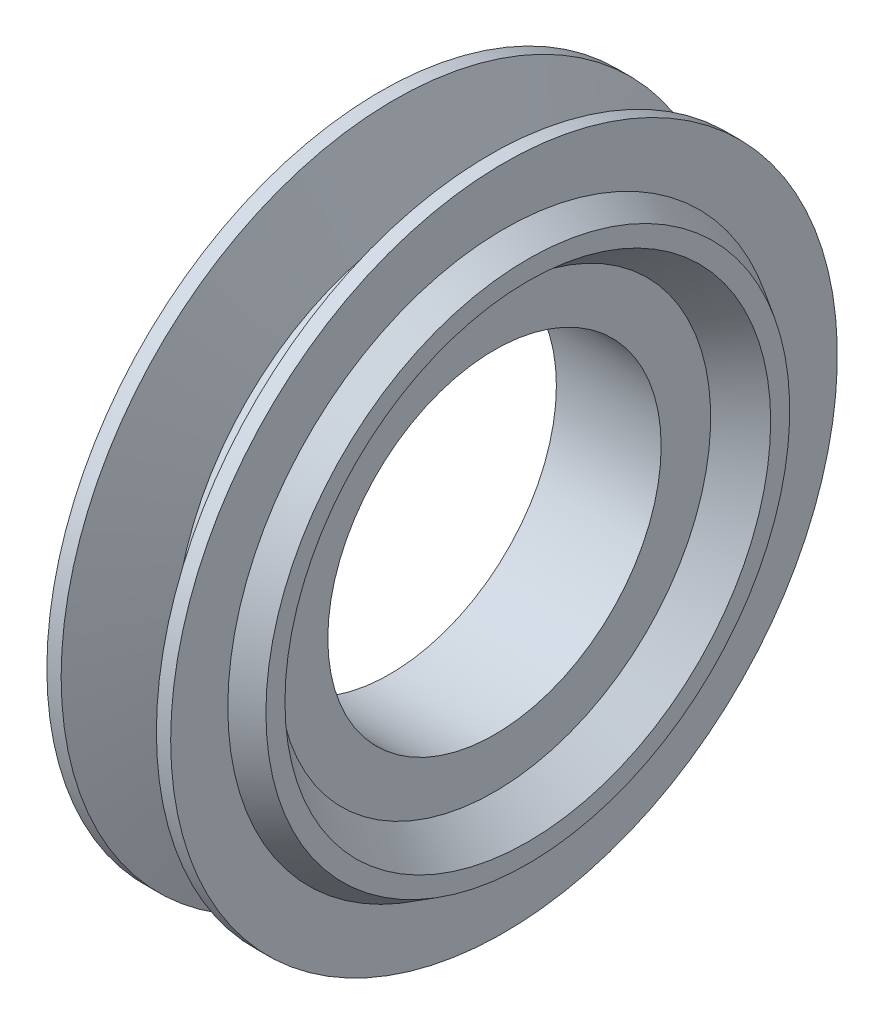
ISO-10303-21;
HEADER;
FILE_DESCRIPTION(('STEP AP214'),'2;1');
FILE_NAME('part.step','',(''),(''),'','','');
FILE_SCHEMA(('AUTOMOTIVE_DESIGN { 1 0 10303 214 1 1 1 1 }'));
ENDSEC;
DATA;
#1=APPLICATION_CONTEXT('core data for automotive mechanical design processes');
#2=APPLICATION_PROTOCOL_DEFINITION('international standard','automotive_design',2000,#1);
#3=PRODUCT_CONTEXT('',#1,'mechanical');
#4=PRODUCT('Part','Part','',(#3));
#5=PRODUCT_RELATED_PRODUCT_CATEGORY('part','',(#4));
#6=PRODUCT_DEFINITION_FORMATION('','',#4);
#7=PRODUCT_DEFINITION_CONTEXT('part definition',#1,'design');
#8=PRODUCT_DEFINITION('design','',#6,#7);
#9=PRODUCT_DEFINITION_SHAPE('','',#8);
#10=(LENGTH_UNIT() NAMED_UNIT(*) SI_UNIT(.MILLI.,.METRE.));
#11=(NAMED_UNIT(*) PLANE_ANGLE_UNIT() SI_UNIT($,.RADIAN.));
#12=(NAMED_UNIT(*) SI_UNIT($,.STERADIAN.) SOLID_ANGLE_UNIT());
#13=UNCERTAINTY_MEASURE_WITH_UNIT(LENGTH_MEASURE(1.E-05),#10,'distance_accuracy_value','');
#14=(GEOMETRIC_REPRESENTATION_CONTEXT(3) GLOBAL_UNCERTAINTY_ASSIGNED_CONTEXT((#13)) GLOBAL_UNIT_ASSIGNED_CONTEXT((#10,
#11,#12)) REPRESENTATION_CONTEXT('',''));
#15=CARTESIAN_POINT('',(0.,0.,0.));
#16=DIRECTION('',(0.,0.,1.));
#17=DIRECTION('',(1.,0.,0.));
#18=AXIS2_PLACEMENT_3D('',#15,#16,#17);
#19=CARTESIAN_POINT('',(5.,0.,0.));
#20=DIRECTION('',(1.,0.,0.));
#21=DIRECTION('',(0.,0.,-1.));
#22=AXIS2_PLACEMENT_3D('',#19,#20,#21);
#23=CONICAL_SURFACE('',#22,35.,1.25638060418322);
#24=CARTESIAN_POINT('',(5.,0.,0.));
#25=DIRECTION('',(-1.,0.,0.));
#26=DIRECTION('',(0.,0.,1.));
#27=AXIS2_PLACEMENT_3D('',#24,#25,#26);
#28=CIRCLE('',#27,35.);
#29=CARTESIAN_POINT('',(5.,0.,35.));
#30=VERTEX_POINT('',#29);
#31=EDGE_CURVE('E68',#30,#30,#28,.T.);
#32=ORIENTED_EDGE('',*,*,#31,.T.);
#33=EDGE_LOOP('',(#32));
#34=FACE_BOUND('',#33,.T.);
#35=CARTESIAN_POINT('',(2.07317073170732,0.,0.));
#36=DIRECTION('',(1.,0.,0.));
#37=DIRECTION('',(0.,0.,-1.));
#38=AXIS2_PLACEMENT_3D('',#35,#36,#37);
#39=CIRCLE('',#38,26.);
#40=CARTESIAN_POINT('',(2.07317073170732,0.,-26.));
#41=VERTEX_POINT('',#40);
#42=EDGE_CURVE('E10',#41,#41,#39,.F.);
#43=ORIENTED_EDGE('',*,*,#42,.F.);
#44=EDGE_LOOP('',(#43));
#45=FACE_BOUND('',#44,.T.);
#46=ADVANCED_FACE('F32',(#34,#45),#23,.T.);
#47=CARTESIAN_POINT('',(-1.,0.,0.));
#48=DIRECTION('',(-1.,0.,0.));
#49=DIRECTION('',(0.,0.,1.));
#50=AXIS2_PLACEMENT_3D('',#47,#48,#49);
#51=CONICAL_SURFACE('',#50,22.7,1.25638060418322);
#52=CARTESIAN_POINT('',(-5.,0.,0.));
#53=DIRECTION('',(-1.,0.,0.));
#54=DIRECTION('',(0.,0.,1.));
#55=AXIS2_PLACEMENT_3D('',#52,#53,#54);
#56=CIRCLE('',#55,35.);
#57=CARTESIAN_POINT('',(-5.,0.,35.));
#58=VERTEX_POINT('',#57);
#59=EDGE_CURVE('E65',#58,#58,#56,.T.);
#60=ORIENTED_EDGE('',*,*,#59,.F.);
#61=EDGE_LOOP('',(#60));
#62=FACE_BOUND('',#61,.T.);
#63=CARTESIAN_POINT('',(-2.07317073170732,0.,0.));
#64=DIRECTION('',(-1.,0.,0.));
#65=DIRECTION('',(0.,0.,1.));
#66=AXIS2_PLACEMENT_3D('',#63,#64,#65);
#67=CIRCLE('',#66,26.);
#68=CARTESIAN_POINT('',(-2.07317073170732,0.,26.));
#69=VERTEX_POINT('',#68);
#70=EDGE_CURVE('E36',#69,#69,#67,.F.);
#71=ORIENTED_EDGE('',*,*,#70,.F.);
#72=EDGE_LOOP('',(#71));
#73=FACE_BOUND('',#72,.T.);
#74=ADVANCED_FACE('F104',(#62,#73),#51,.T.);
#75=CARTESIAN_POINT('',(5.5,0.,0.));
#76=DIRECTION('',(-1.,0.,0.));
#77=DIRECTION('',(0.,0.,1.));
#78=AXIS2_PLACEMENT_3D('',#75,#76,#77);
#79=PLANE('',#78);
#80=CARTESIAN_POINT('',(5.5,0.,0.));
#81=DIRECTION('',(1.,0.,0.));
#82=DIRECTION('',(0.,0.,-1.));
#83=AXIS2_PLACEMENT_3D('',#80,#81,#82);
#84=CIRCLE('',#83,17.5);
#85=CARTESIAN_POINT('',(5.5,0.,-17.5));
#86=VERTEX_POINT('',#85);
#87=EDGE_CURVE('E46',#86,#86,#84,.T.);
#88=ORIENTED_EDGE('',*,*,#87,.F.);
#89=EDGE_LOOP('',(#88));
#90=FACE_BOUND('',#89,.T.);
#91=CARTESIAN_POINT('',(5.5,0.,0.));
#92=DIRECTION('',(-1.,0.,0.));
#93=DIRECTION('',(0.,0.,1.));
#94=AXIS2_PLACEMENT_3D('',#91,#92,#93);
#95=CIRCLE('',#94,22.7);
#96=CARTESIAN_POINT('',(5.5,0.,22.7));
#97=VERTEX_POINT('',#96);
#98=EDGE_CURVE('E44',#97,#97,#95,.T.);
#99=ORIENTED_EDGE('',*,*,#98,.F.);
#100=EDGE_LOOP('',(#99));
#101=FACE_BOUND('',#100,.T.);
#102=ADVANCED_FACE('F34',(#90,#101),#79,.F.);
#103=CARTESIAN_POINT('',(5.5,0.,0.));
#104=DIRECTION('',(1.,0.,0.));
#105=DIRECTION('',(0.,0.,-1.));
#106=AXIS2_PLACEMENT_3D('',#103,#104,#105);
#107=CONICAL_SURFACE('',#106,22.7,0.674740942223553);
#108=CARTESIAN_POINT('',(8.99999999999999,0.,0.));
#109=DIRECTION('',(-1.,0.,0.));
#110=DIRECTION('',(0.,0.,1.));
#111=AXIS2_PLACEMENT_3D('',#108,#109,#110);
#112=CIRCLE('',#111,25.5);
#113=CARTESIAN_POINT('',(8.99999999999999,0.,25.5));
#114=VERTEX_POINT('',#113);
#115=EDGE_CURVE('E80',#114,#114,#112,.T.);
#116=ORIENTED_EDGE('',*,*,#115,.F.);
#117=EDGE_LOOP('',(#116));
#118=FACE_BOUND('',#117,.T.);
#119=ORIENTED_EDGE('',*,*,#98,.T.);
#120=EDGE_LOOP('',(#119));
#121=FACE_BOUND('',#120,.T.);
#122=ADVANCED_FACE('F130',(#118,#121),#107,.F.);
#123=CARTESIAN_POINT('',(9.,25.5,0.));
#124=DIRECTION('',(-1.,0.,0.));
#125=DIRECTION('',(0.,0.,1.));
#126=AXIS2_PLACEMENT_3D('',#123,#124,#125);
#127=PLANE('',#126);
#128=CARTESIAN_POINT('',(8.99999999999999,0.,0.));
#129=DIRECTION('',(-1.,0.,0.));
#130=DIRECTION('',(0.,0.,1.));
#131=AXIS2_PLACEMENT_3D('',#128,#129,#130);
#132=CIRCLE('',#131,27.5);
#133=CARTESIAN_POINT('',(8.99999999999999,0.,27.5));
#134=VERTEX_POINT('',#133);
#135=EDGE_CURVE('E77',#134,#134,#132,.T.);
#136=ORIENTED_EDGE('',*,*,#135,.F.);
#137=EDGE_LOOP('',(#136));
#138=FACE_BOUND('',#137,.T.);
#139=ORIENTED_EDGE('',*,*,#115,.T.);
#140=EDGE_LOOP('',(#139));
#141=FACE_BOUND('',#140,.T.);
#142=ADVANCED_FACE('F127',(#138,#141),#127,.F.);
#143=CARTESIAN_POINT('',(8.99999999999999,0.,0.));
#144=DIRECTION('',(-1.,0.,0.));
#145=DIRECTION('',(0.,0.,1.));
#146=AXIS2_PLACEMENT_3D('',#143,#144,#145);
#147=CONICAL_SURFACE('',#146,27.5,0.540419500270585);
#148=CARTESIAN_POINT('',(6.5,0.,0.));
#149=DIRECTION('',(-1.,0.,0.));
#150=DIRECTION('',(0.,0.,1.));
#151=AXIS2_PLACEMENT_3D('',#148,#149,#150);
#152=CIRCLE('',#151,29.);
#153=CARTESIAN_POINT('',(6.5,0.,29.));
#154=VERTEX_POINT('',#153);
#155=EDGE_CURVE('E74',#154,#154,#152,.T.);
#156=ORIENTED_EDGE('',*,*,#155,.F.);
#157=EDGE_LOOP('',(#156));
#158=FACE_BOUND('',#157,.T.);
#159=ORIENTED_EDGE('',*,*,#135,.T.);
#160=EDGE_LOOP('',(#159));
#161=FACE_BOUND('',#160,.T.);
#162=ADVANCED_FACE('F123',(#158,#161),#147,.T.);
#163=CARTESIAN_POINT('',(6.5,29.,0.));
#164=DIRECTION('',(-1.,0.,0.));
#165=DIRECTION('',(0.,0.,1.));
#166=AXIS2_PLACEMENT_3D('',#163,#164,#165);
#167=PLANE('',#166);
#168=CARTESIAN_POINT('',(6.5,0.,0.));
#169=DIRECTION('',(-1.,0.,0.));
#170=DIRECTION('',(0.,0.,1.));
#171=AXIS2_PLACEMENT_3D('',#168,#169,#170);
#172=CIRCLE('',#171,35.);
#173=CARTESIAN_POINT('',(6.5,0.,35.));
#174=VERTEX_POINT('',#173);
#175=EDGE_CURVE('E71',#174,#174,#172,.T.);
#176=ORIENTED_EDGE('',*,*,#175,.F.);
#177=EDGE_LOOP('',(#176));
#178=FACE_BOUND('',#177,.T.);
#179=ORIENTED_EDGE('',*,*,#155,.T.);
#180=EDGE_LOOP('',(#179));
#181=FACE_BOUND('',#180,.T.);
#182=ADVANCED_FACE('F119',(#178,#181),#167,.F.);
#183=CARTESIAN_POINT('',(-55.5491994637289,0.,0.));
#184=DIRECTION('',(-1.,0.,0.));
#185=DIRECTION('',(0.,0.,1.));
#186=AXIS2_PLACEMENT_3D('',#183,#184,#185);
#187=CYLINDRICAL_SURFACE('',#186,35.);
#188=ORIENTED_EDGE('',*,*,#31,.F.);
#189=EDGE_LOOP('',(#188));
#190=FACE_BOUND('',#189,.T.);
#191=ORIENTED_EDGE('',*,*,#175,.T.);
#192=EDGE_LOOP('',(#191));
#193=FACE_BOUND('',#192,.T.);
#194=ADVANCED_FACE('F115',(#190,#193),#187,.T.);
#195=CARTESIAN_POINT('',(-55.5491994637289,0.,0.));
#196=DIRECTION('',(-1.,0.,0.));
#197=DIRECTION('',(0.,0.,1.));
#198=AXIS2_PLACEMENT_3D('',#195,#196,#197);
#199=CYLINDRICAL_SURFACE('',#198,35.);
#200=CARTESIAN_POINT('',(-6.5,0.,0.));
#201=DIRECTION('',(-1.,0.,0.));
#202=DIRECTION('',(0.,0.,1.));
#203=AXIS2_PLACEMENT_3D('',#200,#201,#202);
#204=CIRCLE('',#203,35.);
#205=CARTESIAN_POINT('',(-6.5,0.,35.));
#206=VERTEX_POINT('',#205);
#207=EDGE_CURVE('E62',#206,#206,#204,.T.);
#208=ORIENTED_EDGE('',*,*,#207,.F.);
#209=EDGE_LOOP('',(#208));
#210=FACE_BOUND('',#209,.T.);
#211=ORIENTED_EDGE('',*,*,#59,.T.);
#212=EDGE_LOOP('',(#211));
#213=FACE_BOUND('',#212,.T.);
#214=ADVANCED_FACE('F118',(#210,#213),#199,.T.);
#215=CARTESIAN_POINT('',(-6.5,35.,0.));
#216=DIRECTION('',(1.,0.,0.));
#217=DIRECTION('',(0.,0.,-1.));
#218=AXIS2_PLACEMENT_3D('',#215,#216,#217);
#219=PLANE('',#218);
#220=CARTESIAN_POINT('',(-6.5,0.,0.));
#221=DIRECTION('',(-1.,0.,0.));
#222=DIRECTION('',(0.,0.,1.));
#223=AXIS2_PLACEMENT_3D('',#220,#221,#222);
#224=CIRCLE('',#223,29.);
#225=CARTESIAN_POINT('',(-6.5,0.,29.));
#226=VERTEX_POINT('',#225);
#227=EDGE_CURVE('E59',#226,#226,#224,.T.);
#228=ORIENTED_EDGE('',*,*,#227,.F.);
#229=EDGE_LOOP('',(#228));
#230=FACE_BOUND('',#229,.T.);
#231=ORIENTED_EDGE('',*,*,#207,.T.);
#232=EDGE_LOOP('',(#231));
#233=FACE_BOUND('',#232,.T.);
#234=ADVANCED_FACE('F194',(#230,#233),#219,.F.);
#235=CARTESIAN_POINT('',(-6.5,0.,0.));
#236=DIRECTION('',(1.,0.,0.));
#237=DIRECTION('',(0.,0.,-1.));
#238=AXIS2_PLACEMENT_3D('',#235,#236,#237);
#239=CONICAL_SURFACE('',#238,29.,0.540419500270584);
#240=CARTESIAN_POINT('',(-9.,0.,0.));
#241=DIRECTION('',(-1.,0.,0.));
#242=DIRECTION('',(0.,0.,1.));
#243=AXIS2_PLACEMENT_3D('',#240,#241,#242);
#244=CIRCLE('',#243,27.5);
#245=CARTESIAN_POINT('',(-9.,0.,27.5));
#246=VERTEX_POINT('',#245);
#247=EDGE_CURVE('E56',#246,#246,#244,.T.);
#248=ORIENTED_EDGE('',*,*,#247,.F.);
#249=EDGE_LOOP('',(#248));
#250=FACE_BOUND('',#249,.T.);
#251=ORIENTED_EDGE('',*,*,#227,.T.);
#252=EDGE_LOOP('',(#251));
#253=FACE_BOUND('',#252,.T.);
#254=ADVANCED_FACE('F186',(#250,#253),#239,.T.);
#255=CARTESIAN_POINT('',(-9.,27.5,0.));
#256=DIRECTION('',(1.,0.,0.));
#257=DIRECTION('',(0.,0.,-1.));
#258=AXIS2_PLACEMENT_3D('',#255,#256,#257);
#259=PLANE('',#258);
#260=CARTESIAN_POINT('',(-8.99999999999999,0.,0.));
#261=DIRECTION('',(-1.,0.,0.));
#262=DIRECTION('',(0.,0.,1.));
#263=AXIS2_PLACEMENT_3D('',#260,#261,#262);
#264=CIRCLE('',#263,25.5);
#265=CARTESIAN_POINT('',(-8.99999999999999,0.,25.5));
#266=VERTEX_POINT('',#265);
#267=EDGE_CURVE('E53',#266,#266,#264,.T.);
#268=ORIENTED_EDGE('',*,*,#267,.F.);
#269=EDGE_LOOP('',(#268));
#270=FACE_BOUND('',#269,.T.);
#271=ORIENTED_EDGE('',*,*,#247,.T.);
#272=EDGE_LOOP('',(#271));
#273=FACE_BOUND('',#272,.T.);
#274=ADVANCED_FACE('F179',(#270,#273),#259,.F.);
#275=CARTESIAN_POINT('',(-8.99999999999999,0.,0.));
#276=DIRECTION('',(-1.,0.,0.));
#277=DIRECTION('',(0.,0.,1.));
#278=AXIS2_PLACEMENT_3D('',#275,#276,#277);
#279=CONICAL_SURFACE('',#278,25.5,0.674740942223553);
#280=CARTESIAN_POINT('',(-5.5,0.,0.));
#281=DIRECTION('',(-1.,0.,0.));
#282=DIRECTION('',(0.,0.,1.));
#283=AXIS2_PLACEMENT_3D('',#280,#281,#282);
#284=CIRCLE('',#283,22.7);
#285=CARTESIAN_POINT('',(-5.5,0.,22.7));
#286=VERTEX_POINT('',#285);
#287=EDGE_CURVE('E50',#286,#286,#284,.T.);
#288=ORIENTED_EDGE('',*,*,#287,.F.);
#289=EDGE_LOOP('',(#288));
#290=FACE_BOUND('',#289,.T.);
#291=ORIENTED_EDGE('',*,*,#267,.T.);
#292=EDGE_LOOP('',(#291));
#293=FACE_BOUND('',#292,.T.);
#294=ADVANCED_FACE('F101',(#290,#293),#279,.F.);
#295=CARTESIAN_POINT('',(-5.5,22.7,0.));
#296=DIRECTION('',(1.,0.,0.));
#297=DIRECTION('',(0.,0.,-1.));
#298=AXIS2_PLACEMENT_3D('',#295,#296,#297);
#299=PLANE('',#298);
#300=CARTESIAN_POINT('',(-5.5,0.,0.));
#301=DIRECTION('',(1.,0.,0.));
#302=DIRECTION('',(0.,0.,-1.));
#303=AXIS2_PLACEMENT_3D('',#300,#301,#302);
#304=CIRCLE('',#303,17.5);
#305=CARTESIAN_POINT('',(-5.5,0.,-17.5));
#306=VERTEX_POINT('',#305);
#307=EDGE_CURVE('E49',#306,#306,#304,.T.);
#308=ORIENTED_EDGE('',*,*,#307,.T.);
#309=EDGE_LOOP('',(#308));
#310=FACE_BOUND('',#309,.T.);
#311=ORIENTED_EDGE('',*,*,#287,.T.);
#312=EDGE_LOOP('',(#311));
#313=FACE_BOUND('',#312,.T.);
#314=ADVANCED_FACE('F87',(#310,#313),#299,.F.);
#315=CARTESIAN_POINT('',(-9.,0.,0.));
#316=DIRECTION('',(1.,0.,0.));
#317=DIRECTION('',(0.,0.,-1.));
#318=AXIS2_PLACEMENT_3D('',#315,#316,#317);
#319=CYLINDRICAL_SURFACE('',#318,17.5);
#320=ORIENTED_EDGE('',*,*,#87,.T.);
#321=EDGE_LOOP('',(#320));
#322=FACE_BOUND('',#321,.T.);
#323=ORIENTED_EDGE('',*,*,#307,.F.);
#324=EDGE_LOOP('',(#323));
#325=FACE_BOUND('',#324,.T.);
#326=ADVANCED_FACE('F90',(#322,#325),#319,.F.);
#327=CARTESIAN_POINT('',(-55.5491994637289,0.,0.));
#328=DIRECTION('',(-1.,0.,0.));
#329=DIRECTION('',(0.,0.,1.));
#330=AXIS2_PLACEMENT_3D('',#327,#328,#329);
#331=CYLINDRICAL_SURFACE('',#330,26.);
#332=ORIENTED_EDGE('',*,*,#70,.T.);
#333=EDGE_LOOP('',(#332));
#334=FACE_BOUND('',#333,.T.);
#335=ORIENTED_EDGE('',*,*,#42,.T.);
#336=EDGE_LOOP('',(#335));
#337=FACE_BOUND('',#336,.T.);
#338=ADVANCED_FACE('F92',(#334,#337),#331,.T.);
#339=CLOSED_SHELL('',(#46,#74,#102,#122,#142,#162,#182,#194,#214,#234,#254,#274,#294,#314,#326,#338));
#340=MANIFOLD_SOLID_BREP('B2',#339);
#341=ADVANCED_BREP_SHAPE_REPRESENTATION('',(#18,#340),#14);
#342=SHAPE_DEFINITION_REPRESENTATION(#9,#341);
ENDSEC;
END-ISO-10303-21;
